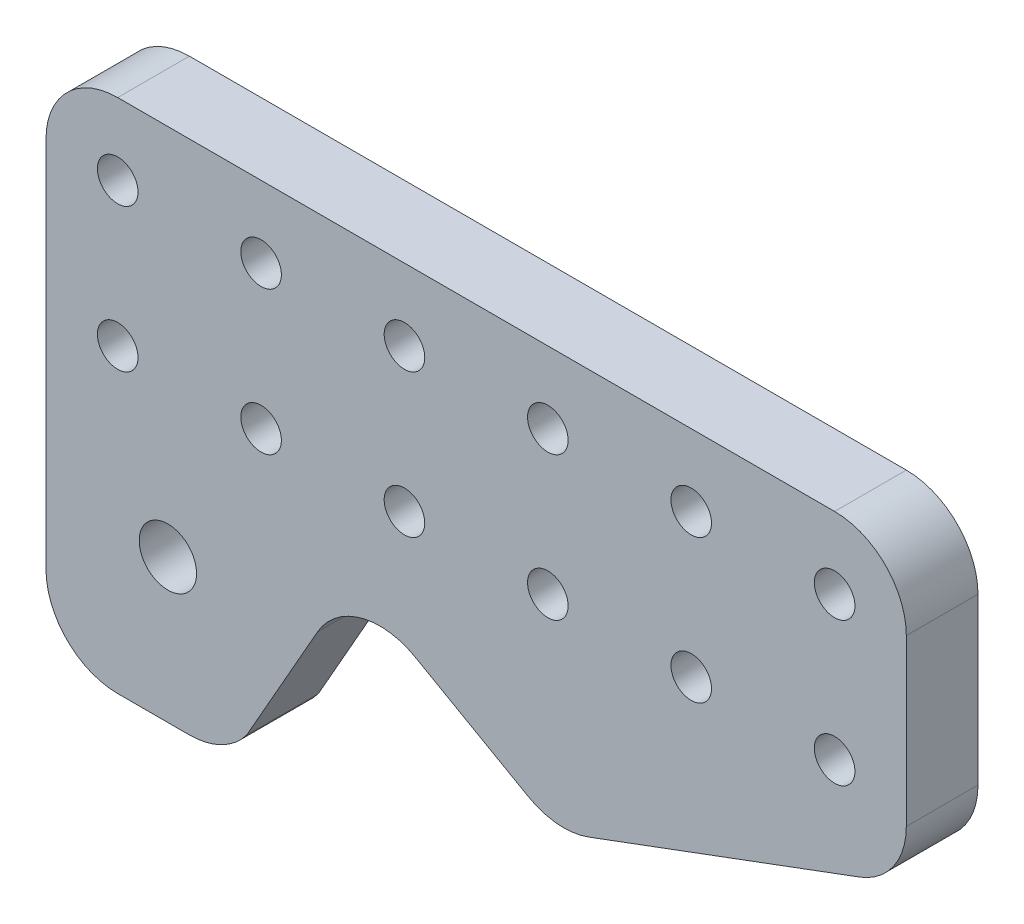
ISO-10303-21;
HEADER;
FILE_DESCRIPTION(('STEP AP214'),'2;1');
FILE_NAME('part.step','',(''),(''),'','','');
FILE_SCHEMA(('AUTOMOTIVE_DESIGN { 1 0 10303 214 1 1 1 1 }'));
ENDSEC;
DATA;
#1=APPLICATION_CONTEXT('core data for automotive mechanical design processes');
#2=APPLICATION_PROTOCOL_DEFINITION('international standard','automotive_design',2000,#1);
#3=PRODUCT_CONTEXT('',#1,'mechanical');
#4=PRODUCT('Part','Part','',(#3));
#5=PRODUCT_RELATED_PRODUCT_CATEGORY('part','',(#4));
#6=PRODUCT_DEFINITION_FORMATION('','',#4);
#7=PRODUCT_DEFINITION_CONTEXT('part definition',#1,'design');
#8=PRODUCT_DEFINITION('design','',#6,#7);
#9=PRODUCT_DEFINITION_SHAPE('','',#8);
#10=(LENGTH_UNIT() NAMED_UNIT(*) SI_UNIT(.MILLI.,.METRE.));
#11=(NAMED_UNIT(*) PLANE_ANGLE_UNIT() SI_UNIT($,.RADIAN.));
#12=(NAMED_UNIT(*) SI_UNIT($,.STERADIAN.) SOLID_ANGLE_UNIT());
#13=UNCERTAINTY_MEASURE_WITH_UNIT(LENGTH_MEASURE(1.E-05),#10,'distance_accuracy_value','');
#14=(GEOMETRIC_REPRESENTATION_CONTEXT(3) GLOBAL_UNCERTAINTY_ASSIGNED_CONTEXT((#13)) GLOBAL_UNIT_ASSIGNED_CONTEXT((#10,
#11,#12)) REPRESENTATION_CONTEXT('',''));
#15=CARTESIAN_POINT('',(0.,0.,0.));
#16=DIRECTION('',(0.,0.,1.));
#17=DIRECTION('',(1.,0.,0.));
#18=AXIS2_PLACEMENT_3D('',#15,#16,#17);
#19=CARTESIAN_POINT('',(0.,0.,6.35));
#20=DIRECTION('',(0.,0.,-1.));
#21=DIRECTION('',(-1.,0.,0.));
#22=AXIS2_PLACEMENT_3D('',#19,#20,#21);
#23=PLANE('',#22);
#24=DIRECTION('',(-0.869580115609544,0.493791881804968,0.));
#25=VECTOR('',#24,1.);
#26=CARTESIAN_POINT('',(27.1867353483846,19.1055012023618,6.35));
#27=LINE('',#26,#25);
#28=CARTESIAN_POINT('',(42.7225109022937,10.2834965263614,6.35));
#29=VERTEX_POINT('',#28);
#30=CARTESIAN_POINT('',(32.7085690825052,15.9699227529003,6.35));
#31=VERTEX_POINT('',#30);
#32=EDGE_CURVE('E247',#29,#31,#27,.T.);
#33=ORIENTED_EDGE('',*,*,#32,.F.);
#34=CARTESIAN_POINT('',(45.8580893517552,15.805330260482,6.35));
#35=DIRECTION('',(0.,0.,-1.));
#36=DIRECTION('',(-1.,0.,0.));
#37=AXIS2_PLACEMENT_3D('',#34,#35,#36);
#38=CIRCLE('',#37,6.35);
#39=CARTESIAN_POINT('',(48.0725484230912,9.85397150626651,6.35));
#40=VERTEX_POINT('',#39);
#41=EDGE_CURVE('E282',#29,#40,#38,.F.);
#42=ORIENTED_EDGE('',*,*,#41,.T.);
#43=DIRECTION('',(0.937221851057562,0.348733712021418,0.));
#44=VECTOR('',#43,1.);
#45=CARTESIAN_POINT('',(21.59,0.,6.35));
#46=LINE('',#45,#44);
#47=CARTESIAN_POINT('',(72.064459071336,18.7811940730553,6.35));
#48=VERTEX_POINT('',#47);
#49=EDGE_CURVE('E291',#40,#48,#46,.T.);
#50=ORIENTED_EDGE('',*,*,#49,.T.);
#51=CARTESIAN_POINT('',(69.85,24.7325528272708,6.35));
#52=DIRECTION('',(0.,0.,-1.));
#53=DIRECTION('',(-1.,0.,0.));
#54=AXIS2_PLACEMENT_3D('',#51,#52,#53);
#55=CIRCLE('',#54,6.35);
#56=CARTESIAN_POINT('',(76.2,24.7325528272708,6.35));
#57=VERTEX_POINT('',#56);
#58=EDGE_CURVE('E279',#48,#57,#55,.F.);
#59=ORIENTED_EDGE('',*,*,#58,.T.);
#60=DIRECTION('',(0.,1.,0.));
#61=VECTOR('',#60,1.);
#62=CARTESIAN_POINT('',(76.2,20.32,6.35));
#63=LINE('',#62,#61);
#64=CARTESIAN_POINT('',(76.2,39.37,6.35));
#65=VERTEX_POINT('',#64);
#66=EDGE_CURVE('E305',#57,#65,#63,.T.);
#67=ORIENTED_EDGE('',*,*,#66,.T.);
#68=CARTESIAN_POINT('',(69.85,39.37,6.35));
#69=DIRECTION('',(0.,0.,-1.));
#70=DIRECTION('',(-1.,0.,0.));
#71=AXIS2_PLACEMENT_3D('',#68,#69,#70);
#72=CIRCLE('',#71,6.35);
#73=CARTESIAN_POINT('',(69.85,45.72,6.35));
#74=VERTEX_POINT('',#73);
#75=EDGE_CURVE('E276',#65,#74,#72,.F.);
#76=ORIENTED_EDGE('',*,*,#75,.T.);
#77=DIRECTION('',(-1.,0.,0.));
#78=VECTOR('',#77,1.);
#79=CARTESIAN_POINT('',(0.,45.72,6.35));
#80=LINE('',#79,#78);
#81=CARTESIAN_POINT('',(6.35,45.72,6.35));
#82=VERTEX_POINT('',#81);
#83=EDGE_CURVE('E426',#74,#82,#80,.T.);
#84=ORIENTED_EDGE('',*,*,#83,.T.);
#85=CARTESIAN_POINT('',(6.35,39.37,6.35));
#86=DIRECTION('',(0.,0.,-1.));
#87=DIRECTION('',(-1.,0.,0.));
#88=AXIS2_PLACEMENT_3D('',#85,#86,#87);
#89=CIRCLE('',#88,6.35);
#90=CARTESIAN_POINT('',(0.,39.37,6.35));
#91=VERTEX_POINT('',#90);
#92=EDGE_CURVE('E274',#82,#91,#89,.F.);
#93=ORIENTED_EDGE('',*,*,#92,.T.);
#94=DIRECTION('',(0.,-1.,0.));
#95=VECTOR('',#94,1.);
#96=CARTESIAN_POINT('',(0.,45.72,6.35));
#97=LINE('',#96,#95);
#98=CARTESIAN_POINT('',(0.,6.35,6.35));
#99=VERTEX_POINT('',#98);
#100=EDGE_CURVE('E430',#91,#99,#97,.T.);
#101=ORIENTED_EDGE('',*,*,#100,.T.);
#102=CARTESIAN_POINT('',(6.35,6.35,6.35));
#103=DIRECTION('',(0.,0.,-1.));
#104=DIRECTION('',(-1.,0.,0.));
#105=AXIS2_PLACEMENT_3D('',#102,#103,#104);
#106=CIRCLE('',#105,6.35);
#107=CARTESIAN_POINT('',(6.35,0.,6.35));
#108=VERTEX_POINT('',#107);
#109=EDGE_CURVE('E265',#99,#108,#106,.F.);
#110=ORIENTED_EDGE('',*,*,#109,.T.);
#111=DIRECTION('',(1.,0.,0.));
#112=VECTOR('',#111,1.);
#113=CARTESIAN_POINT('',(0.,0.,6.35));
#114=LINE('',#113,#112);
#115=CARTESIAN_POINT('',(12.7,0.,6.35));
#116=VERTEX_POINT('',#115);
#117=EDGE_CURVE('E298',#108,#116,#114,.T.);
#118=ORIENTED_EDGE('',*,*,#117,.T.);
#119=CARTESIAN_POINT('',(12.7,6.35,6.35));
#120=DIRECTION('',(0.,0.,-1.));
#121=DIRECTION('',(-1.,0.,0.));
#122=AXIS2_PLACEMENT_3D('',#119,#120,#121);
#123=CIRCLE('',#122,6.35);
#124=CARTESIAN_POINT('',(17.78,2.54,6.35));
#125=VERTEX_POINT('',#124);
#126=EDGE_CURVE('E261',#116,#125,#123,.F.);
#127=ORIENTED_EDGE('',*,*,#126,.T.);
#128=DIRECTION('',(-0.493791881804968,-0.869580115609545,0.));
#129=VECTOR('',#128,1.);
#130=CARTESIAN_POINT('',(17.78,2.54,6.35));
#131=LINE('',#130,#129);
#132=CARTESIAN_POINT('',(24.0511568989231,13.5836674682412,6.35));
#133=VERTEX_POINT('',#132);
#134=EDGE_CURVE('E190',#133,#125,#131,.T.);
#135=ORIENTED_EDGE('',*,*,#134,.F.);
#136=CARTESIAN_POINT('',(29.5729906330437,10.4480890187797,6.35));
#137=DIRECTION('',(0.,0.,-1.));
#138=DIRECTION('',(-1.,0.,0.));
#139=AXIS2_PLACEMENT_3D('',#136,#137,#138);
#140=CIRCLE('',#139,6.35);
#141=EDGE_CURVE('E52',#133,#31,#140,.T.);
#142=ORIENTED_EDGE('',*,*,#141,.T.);
#143=EDGE_LOOP('',(#33,#42,#50,#59,#67,#76,#84,#93,#101,#110,#118,#127,#135,#142));
#144=FACE_BOUND('',#143,.T.);
#145=CARTESIAN_POINT('',(10.795,12.7,6.35));
#146=DIRECTION('',(0.,0.,1.));
#147=DIRECTION('',(1.,0.,0.));
#148=AXIS2_PLACEMENT_3D('',#145,#146,#147);
#149=CIRCLE('',#148,2.54);
#150=CARTESIAN_POINT('',(13.335,12.7,6.35));
#151=VERTEX_POINT('',#150);
#152=EDGE_CURVE('E308',#151,#151,#149,.T.);
#153=ORIENTED_EDGE('',*,*,#152,.F.);
#154=EDGE_LOOP('',(#153));
#155=FACE_BOUND('',#154,.T.);
#156=CARTESIAN_POINT('',(69.85,39.37,6.35));
#157=DIRECTION('',(0.,0.,1.));
#158=DIRECTION('',(1.,0.,0.));
#159=AXIS2_PLACEMENT_3D('',#156,#157,#158);
#160=CIRCLE('',#159,1.79773058504601);
#161=CARTESIAN_POINT('',(71.647730585046,39.37,6.35));
#162=VERTEX_POINT('',#161);
#163=EDGE_CURVE('E414',#162,#162,#160,.T.);
#164=ORIENTED_EDGE('',*,*,#163,.F.);
#165=EDGE_LOOP('',(#164));
#166=FACE_BOUND('',#165,.T.);
#167=CARTESIAN_POINT('',(57.15,39.3699999999999,6.35));
#168=DIRECTION('',(0.,0.,1.));
#169=DIRECTION('',(1.,0.,0.));
#170=AXIS2_PLACEMENT_3D('',#167,#168,#169);
#171=CIRCLE('',#170,1.79773058504601);
#172=CARTESIAN_POINT('',(58.947730585046,39.3699999999999,6.35));
#173=VERTEX_POINT('',#172);
#174=EDGE_CURVE('E406',#173,#173,#171,.T.);
#175=ORIENTED_EDGE('',*,*,#174,.F.);
#176=EDGE_LOOP('',(#175));
#177=FACE_BOUND('',#176,.T.);
#178=CARTESIAN_POINT('',(44.45,39.3699999999998,6.35));
#179=DIRECTION('',(0.,0.,1.));
#180=DIRECTION('',(1.,0.,0.));
#181=AXIS2_PLACEMENT_3D('',#178,#179,#180);
#182=CIRCLE('',#181,1.79773058504601);
#183=CARTESIAN_POINT('',(46.247730585046,39.3699999999998,6.35));
#184=VERTEX_POINT('',#183);
#185=EDGE_CURVE('E398',#184,#184,#182,.T.);
#186=ORIENTED_EDGE('',*,*,#185,.F.);
#187=EDGE_LOOP('',(#186));
#188=FACE_BOUND('',#187,.T.);
#189=CARTESIAN_POINT('',(31.75,39.3699999999997,6.35));
#190=DIRECTION('',(0.,0.,1.));
#191=DIRECTION('',(1.,0.,0.));
#192=AXIS2_PLACEMENT_3D('',#189,#190,#191);
#193=CIRCLE('',#192,1.79773058504601);
#194=CARTESIAN_POINT('',(33.5477305850461,39.3699999999997,6.35));
#195=VERTEX_POINT('',#194);
#196=EDGE_CURVE('E390',#195,#195,#193,.T.);
#197=ORIENTED_EDGE('',*,*,#196,.F.);
#198=EDGE_LOOP('',(#197));
#199=FACE_BOUND('',#198,.T.);
#200=CARTESIAN_POINT('',(19.0500000000001,39.3699999999996,6.35));
#201=DIRECTION('',(0.,0.,1.));
#202=DIRECTION('',(1.,0.,0.));
#203=AXIS2_PLACEMENT_3D('',#200,#201,#202);
#204=CIRCLE('',#203,1.797730585046);
#205=CARTESIAN_POINT('',(20.8477305850461,39.3699999999996,6.35));
#206=VERTEX_POINT('',#205);
#207=EDGE_CURVE('E384',#206,#206,#204,.T.);
#208=ORIENTED_EDGE('',*,*,#207,.F.);
#209=EDGE_LOOP('',(#208));
#210=FACE_BOUND('',#209,.T.);
#211=CARTESIAN_POINT('',(6.35000000000006,39.3699999999996,6.35));
#212=DIRECTION('',(0.,0.,1.));
#213=DIRECTION('',(1.,0.,0.));
#214=AXIS2_PLACEMENT_3D('',#211,#212,#213);
#215=CIRCLE('',#214,1.79773058504601);
#216=CARTESIAN_POINT('',(8.14773058504607,39.3699999999996,6.35));
#217=VERTEX_POINT('',#216);
#218=EDGE_CURVE('E378',#217,#217,#215,.T.);
#219=ORIENTED_EDGE('',*,*,#218,.F.);
#220=EDGE_LOOP('',(#219));
#221=FACE_BOUND('',#220,.T.);
#222=CARTESIAN_POINT('',(57.1500000000002,26.6699999999999,6.35));
#223=DIRECTION('',(0.,0.,1.));
#224=DIRECTION('',(1.,0.,0.));
#225=AXIS2_PLACEMENT_3D('',#222,#223,#224);
#226=CIRCLE('',#225,1.79773058504601);
#227=CARTESIAN_POINT('',(58.9477305850462,26.6699999999999,6.35));
#228=VERTEX_POINT('',#227);
#229=EDGE_CURVE('E370',#228,#228,#226,.T.);
#230=ORIENTED_EDGE('',*,*,#229,.F.);
#231=EDGE_LOOP('',(#230));
#232=FACE_BOUND('',#231,.T.);
#233=CARTESIAN_POINT('',(44.4500000000002,26.6699999999998,6.35));
#234=DIRECTION('',(0.,0.,1.));
#235=DIRECTION('',(1.,0.,0.));
#236=AXIS2_PLACEMENT_3D('',#233,#234,#235);
#237=CIRCLE('',#236,1.79773058504601);
#238=CARTESIAN_POINT('',(46.2477305850462,26.6699999999998,6.35));
#239=VERTEX_POINT('',#238);
#240=EDGE_CURVE('E362',#239,#239,#237,.T.);
#241=ORIENTED_EDGE('',*,*,#240,.F.);
#242=EDGE_LOOP('',(#241));
#243=FACE_BOUND('',#242,.T.);
#244=CARTESIAN_POINT('',(31.7500000000002,26.6699999999998,6.35));
#245=DIRECTION('',(0.,0.,1.));
#246=DIRECTION('',(1.,0.,0.));
#247=AXIS2_PLACEMENT_3D('',#244,#245,#246);
#248=CIRCLE('',#247,1.79773058504601);
#249=CARTESIAN_POINT('',(33.5477305850462,26.6699999999998,6.35));
#250=VERTEX_POINT('',#249);
#251=EDGE_CURVE('E354',#250,#250,#248,.T.);
#252=ORIENTED_EDGE('',*,*,#251,.F.);
#253=EDGE_LOOP('',(#252));
#254=FACE_BOUND('',#253,.T.);
#255=CARTESIAN_POINT('',(19.0500000000002,26.6699999999997,6.35));
#256=DIRECTION('',(0.,0.,1.));
#257=DIRECTION('',(1.,0.,0.));
#258=AXIS2_PLACEMENT_3D('',#255,#256,#257);
#259=CIRCLE('',#258,1.79773058504601);
#260=CARTESIAN_POINT('',(20.8477305850462,26.6699999999997,6.35));
#261=VERTEX_POINT('',#260);
#262=EDGE_CURVE('E346',#261,#261,#259,.T.);
#263=ORIENTED_EDGE('',*,*,#262,.F.);
#264=EDGE_LOOP('',(#263));
#265=FACE_BOUND('',#264,.T.);
#266=CARTESIAN_POINT('',(6.3500000000002,26.6699999999996,6.35));
#267=DIRECTION('',(0.,0.,1.));
#268=DIRECTION('',(1.,0.,0.));
#269=AXIS2_PLACEMENT_3D('',#266,#267,#268);
#270=CIRCLE('',#269,1.79773058504601);
#271=CARTESIAN_POINT('',(8.14773058504621,26.6699999999996,6.35));
#272=VERTEX_POINT('',#271);
#273=EDGE_CURVE('E338',#272,#272,#270,.T.);
#274=ORIENTED_EDGE('',*,*,#273,.F.);
#275=EDGE_LOOP('',(#274));
#276=FACE_BOUND('',#275,.T.);
#277=CARTESIAN_POINT('',(69.8500000000002,26.67,6.35));
#278=DIRECTION('',(0.,0.,1.));
#279=DIRECTION('',(1.,0.,0.));
#280=AXIS2_PLACEMENT_3D('',#277,#278,#279);
#281=CIRCLE('',#280,1.79773058504601);
#282=CARTESIAN_POINT('',(71.6477305850462,26.67,6.35));
#283=VERTEX_POINT('',#282);
#284=EDGE_CURVE('E331',#283,#283,#281,.T.);
#285=ORIENTED_EDGE('',*,*,#284,.F.);
#286=EDGE_LOOP('',(#285));
#287=FACE_BOUND('',#286,.T.);
#288=ADVANCED_FACE('F43',(#144,#155,#166,#177,#188,#199,#210,#221,#232,#243,#254,#265,#276,
#287),#23,.F.);
#289=CARTESIAN_POINT('',(0.,0.,0.));
#290=DIRECTION('',(0.,0.,-1.));
#291=DIRECTION('',(-1.,0.,0.));
#292=AXIS2_PLACEMENT_3D('',#289,#290,#291);
#293=PLANE('',#292);
#294=DIRECTION('',(0.937221851057562,0.348733712021418,0.));
#295=VECTOR('',#294,1.);
#296=CARTESIAN_POINT('',(21.59,0.,0.));
#297=LINE('',#296,#295);
#298=CARTESIAN_POINT('',(48.0725484230912,9.85397150626651,0.));
#299=VERTEX_POINT('',#298);
#300=CARTESIAN_POINT('',(72.064459071336,18.7811940730553,0.));
#301=VERTEX_POINT('',#300);
#302=EDGE_CURVE('E293',#299,#301,#297,.T.);
#303=ORIENTED_EDGE('',*,*,#302,.F.);
#304=CARTESIAN_POINT('',(45.8580893517552,15.805330260482,0.));
#305=DIRECTION('',(0.,0.,-1.));
#306=DIRECTION('',(-1.,0.,0.));
#307=AXIS2_PLACEMENT_3D('',#304,#305,#306);
#308=CIRCLE('',#307,6.35);
#309=CARTESIAN_POINT('',(42.7225109022937,10.2834965263614,0.));
#310=VERTEX_POINT('',#309);
#311=EDGE_CURVE('E216',#299,#310,#308,.T.);
#312=ORIENTED_EDGE('',*,*,#311,.T.);
#313=DIRECTION('',(-0.869580115609544,0.493791881804968,0.));
#314=VECTOR('',#313,1.);
#315=CARTESIAN_POINT('',(27.1867353483846,19.1055012023618,0.));
#316=LINE('',#315,#314);
#317=CARTESIAN_POINT('',(32.7085690825052,15.9699227529003,0.));
#318=VERTEX_POINT('',#317);
#319=EDGE_CURVE('E184',#310,#318,#316,.T.);
#320=ORIENTED_EDGE('',*,*,#319,.T.);
#321=CARTESIAN_POINT('',(29.5729906330437,10.4480890187797,0.));
#322=DIRECTION('',(0.,0.,-1.));
#323=DIRECTION('',(-1.,0.,0.));
#324=AXIS2_PLACEMENT_3D('',#321,#322,#323);
#325=CIRCLE('',#324,6.35);
#326=CARTESIAN_POINT('',(24.0511568989231,13.5836674682412,0.));
#327=VERTEX_POINT('',#326);
#328=EDGE_CURVE('E11',#318,#327,#325,.F.);
#329=ORIENTED_EDGE('',*,*,#328,.T.);
#330=DIRECTION('',(-0.493791881804968,-0.869580115609545,0.));
#331=VECTOR('',#330,1.);
#332=CARTESIAN_POINT('',(17.78,2.54,0.));
#333=LINE('',#332,#331);
#334=CARTESIAN_POINT('',(17.78,2.54,0.));
#335=VERTEX_POINT('',#334);
#336=EDGE_CURVE('E168',#327,#335,#333,.T.);
#337=ORIENTED_EDGE('',*,*,#336,.T.);
#338=CARTESIAN_POINT('',(12.7,6.35,0.));
#339=DIRECTION('',(0.,0.,-1.));
#340=DIRECTION('',(-1.,0.,0.));
#341=AXIS2_PLACEMENT_3D('',#338,#339,#340);
#342=CIRCLE('',#341,6.35);
#343=CARTESIAN_POINT('',(12.7,0.,0.));
#344=VERTEX_POINT('',#343);
#345=EDGE_CURVE('E175',#335,#344,#342,.T.);
#346=ORIENTED_EDGE('',*,*,#345,.T.);
#347=DIRECTION('',(1.,0.,0.));
#348=VECTOR('',#347,1.);
#349=CARTESIAN_POINT('',(0.,0.,0.));
#350=LINE('',#349,#348);
#351=CARTESIAN_POINT('',(6.35,0.,0.));
#352=VERTEX_POINT('',#351);
#353=EDGE_CURVE('E323',#352,#344,#350,.T.);
#354=ORIENTED_EDGE('',*,*,#353,.F.);
#355=CARTESIAN_POINT('',(6.35,6.35,0.));
#356=DIRECTION('',(0.,0.,-1.));
#357=DIRECTION('',(-1.,0.,0.));
#358=AXIS2_PLACEMENT_3D('',#355,#356,#357);
#359=CIRCLE('',#358,6.35);
#360=CARTESIAN_POINT('',(0.,6.35,0.));
#361=VERTEX_POINT('',#360);
#362=EDGE_CURVE('E199',#352,#361,#359,.T.);
#363=ORIENTED_EDGE('',*,*,#362,.T.);
#364=DIRECTION('',(0.,-1.,0.));
#365=VECTOR('',#364,1.);
#366=CARTESIAN_POINT('',(0.,45.72,0.));
#367=LINE('',#366,#365);
#368=CARTESIAN_POINT('',(0.,39.37,0.));
#369=VERTEX_POINT('',#368);
#370=EDGE_CURVE('E312',#369,#361,#367,.T.);
#371=ORIENTED_EDGE('',*,*,#370,.F.);
#372=CARTESIAN_POINT('',(6.35,39.37,0.));
#373=DIRECTION('',(0.,0.,-1.));
#374=DIRECTION('',(-1.,0.,0.));
#375=AXIS2_PLACEMENT_3D('',#372,#373,#374);
#376=CIRCLE('',#375,6.35);
#377=CARTESIAN_POINT('',(6.35,45.72,0.));
#378=VERTEX_POINT('',#377);
#379=EDGE_CURVE('E204',#369,#378,#376,.T.);
#380=ORIENTED_EDGE('',*,*,#379,.T.);
#381=DIRECTION('',(-1.,0.,0.));
#382=VECTOR('',#381,1.);
#383=CARTESIAN_POINT('',(0.,45.72,0.));
#384=LINE('',#383,#382);
#385=CARTESIAN_POINT('',(69.85,45.72,0.));
#386=VERTEX_POINT('',#385);
#387=EDGE_CURVE('E307',#386,#378,#384,.T.);
#388=ORIENTED_EDGE('',*,*,#387,.F.);
#389=CARTESIAN_POINT('',(69.85,39.37,0.));
#390=DIRECTION('',(0.,0.,-1.));
#391=DIRECTION('',(-1.,0.,0.));
#392=AXIS2_PLACEMENT_3D('',#389,#390,#391);
#393=CIRCLE('',#392,6.35);
#394=CARTESIAN_POINT('',(76.2,39.37,0.));
#395=VERTEX_POINT('',#394);
#396=EDGE_CURVE('E61',#386,#395,#393,.T.);
#397=ORIENTED_EDGE('',*,*,#396,.T.);
#398=DIRECTION('',(0.,1.,0.));
#399=VECTOR('',#398,1.);
#400=CARTESIAN_POINT('',(76.2,20.32,0.));
#401=LINE('',#400,#399);
#402=CARTESIAN_POINT('',(76.2,24.7325528272708,0.));
#403=VERTEX_POINT('',#402);
#404=EDGE_CURVE('E303',#403,#395,#401,.T.);
#405=ORIENTED_EDGE('',*,*,#404,.F.);
#406=CARTESIAN_POINT('',(69.85,24.7325528272708,0.));
#407=DIRECTION('',(0.,0.,-1.));
#408=DIRECTION('',(-1.,0.,0.));
#409=AXIS2_PLACEMENT_3D('',#406,#407,#408);
#410=CIRCLE('',#409,6.35);
#411=EDGE_CURVE('E72',#403,#301,#410,.T.);
#412=ORIENTED_EDGE('',*,*,#411,.T.);
#413=EDGE_LOOP('',(#303,#312,#320,#329,#337,#346,#354,#363,#371,#380,#388,#397,#405,#412));
#414=FACE_BOUND('',#413,.T.);
#415=CARTESIAN_POINT('',(6.3500000000002,26.6699999999996,0.));
#416=DIRECTION('',(0.,0.,1.));
#417=DIRECTION('',(1.,0.,0.));
#418=AXIS2_PLACEMENT_3D('',#415,#416,#417);
#419=CIRCLE('',#418,1.79773058504601);
#420=CARTESIAN_POINT('',(8.14773058504621,26.6699999999996,0.));
#421=VERTEX_POINT('',#420);
#422=EDGE_CURVE('E335',#421,#421,#419,.T.);
#423=ORIENTED_EDGE('',*,*,#422,.T.);
#424=EDGE_LOOP('',(#423));
#425=FACE_BOUND('',#424,.T.);
#426=CARTESIAN_POINT('',(31.7500000000002,26.6699999999998,0.));
#427=DIRECTION('',(0.,0.,1.));
#428=DIRECTION('',(1.,0.,0.));
#429=AXIS2_PLACEMENT_3D('',#426,#427,#428);
#430=CIRCLE('',#429,1.79773058504601);
#431=CARTESIAN_POINT('',(33.5477305850462,26.6699999999998,0.));
#432=VERTEX_POINT('',#431);
#433=EDGE_CURVE('E350',#432,#432,#430,.T.);
#434=ORIENTED_EDGE('',*,*,#433,.T.);
#435=EDGE_LOOP('',(#434));
#436=FACE_BOUND('',#435,.T.);
#437=CARTESIAN_POINT('',(57.1500000000002,26.6699999999999,0.));
#438=DIRECTION('',(0.,0.,1.));
#439=DIRECTION('',(1.,0.,0.));
#440=AXIS2_PLACEMENT_3D('',#437,#438,#439);
#441=CIRCLE('',#440,1.79773058504601);
#442=CARTESIAN_POINT('',(58.9477305850462,26.6699999999999,0.));
#443=VERTEX_POINT('',#442);
#444=EDGE_CURVE('E366',#443,#443,#441,.T.);
#445=ORIENTED_EDGE('',*,*,#444,.T.);
#446=EDGE_LOOP('',(#445));
#447=FACE_BOUND('',#446,.T.);
#448=CARTESIAN_POINT('',(19.0500000000001,39.3699999999996,0.));
#449=DIRECTION('',(0.,0.,1.));
#450=DIRECTION('',(1.,0.,0.));
#451=AXIS2_PLACEMENT_3D('',#448,#449,#450);
#452=CIRCLE('',#451,1.797730585046);
#453=CARTESIAN_POINT('',(20.8477305850461,39.3699999999996,0.));
#454=VERTEX_POINT('',#453);
#455=EDGE_CURVE('E381',#454,#454,#452,.T.);
#456=ORIENTED_EDGE('',*,*,#455,.T.);
#457=EDGE_LOOP('',(#456));
#458=FACE_BOUND('',#457,.T.);
#459=CARTESIAN_POINT('',(44.45,39.3699999999998,0.));
#460=DIRECTION('',(0.,0.,1.));
#461=DIRECTION('',(1.,0.,0.));
#462=AXIS2_PLACEMENT_3D('',#459,#460,#461);
#463=CIRCLE('',#462,1.79773058504601);
#464=CARTESIAN_POINT('',(46.247730585046,39.3699999999998,0.));
#465=VERTEX_POINT('',#464);
#466=EDGE_CURVE('E394',#465,#465,#463,.T.);
#467=ORIENTED_EDGE('',*,*,#466,.T.);
#468=EDGE_LOOP('',(#467));
#469=FACE_BOUND('',#468,.T.);
#470=CARTESIAN_POINT('',(69.85,39.37,0.));
#471=DIRECTION('',(0.,0.,1.));
#472=DIRECTION('',(1.,0.,0.));
#473=AXIS2_PLACEMENT_3D('',#470,#471,#472);
#474=CIRCLE('',#473,1.79773058504601);
#475=CARTESIAN_POINT('',(71.647730585046,39.37,0.));
#476=VERTEX_POINT('',#475);
#477=EDGE_CURVE('E410',#476,#476,#474,.T.);
#478=ORIENTED_EDGE('',*,*,#477,.T.);
#479=EDGE_LOOP('',(#478));
#480=FACE_BOUND('',#479,.T.);
#481=CARTESIAN_POINT('',(10.795,12.7,0.));
#482=DIRECTION('',(0.,0.,1.));
#483=DIRECTION('',(1.,0.,0.));
#484=AXIS2_PLACEMENT_3D('',#481,#482,#483);
#485=CIRCLE('',#484,2.54);
#486=CARTESIAN_POINT('',(13.335,12.7,0.));
#487=VERTEX_POINT('',#486);
#488=EDGE_CURVE('E316',#487,#487,#485,.T.);
#489=ORIENTED_EDGE('',*,*,#488,.T.);
#490=EDGE_LOOP('',(#489));
#491=FACE_BOUND('',#490,.T.);
#492=CARTESIAN_POINT('',(57.15,39.3699999999999,0.));
#493=DIRECTION('',(0.,0.,1.));
#494=DIRECTION('',(1.,0.,0.));
#495=AXIS2_PLACEMENT_3D('',#492,#493,#494);
#496=CIRCLE('',#495,1.79773058504601);
#497=CARTESIAN_POINT('',(58.947730585046,39.3699999999999,0.));
#498=VERTEX_POINT('',#497);
#499=EDGE_CURVE('E402',#498,#498,#496,.T.);
#500=ORIENTED_EDGE('',*,*,#499,.T.);
#501=EDGE_LOOP('',(#500));
#502=FACE_BOUND('',#501,.T.);
#503=CARTESIAN_POINT('',(31.75,39.3699999999997,0.));
#504=DIRECTION('',(0.,0.,1.));
#505=DIRECTION('',(1.,0.,0.));
#506=AXIS2_PLACEMENT_3D('',#503,#504,#505);
#507=CIRCLE('',#506,1.79773058504601);
#508=CARTESIAN_POINT('',(33.5477305850461,39.3699999999997,0.));
#509=VERTEX_POINT('',#508);
#510=EDGE_CURVE('E387',#509,#509,#507,.T.);
#511=ORIENTED_EDGE('',*,*,#510,.T.);
#512=EDGE_LOOP('',(#511));
#513=FACE_BOUND('',#512,.T.);
#514=CARTESIAN_POINT('',(6.35000000000006,39.3699999999996,0.));
#515=DIRECTION('',(0.,0.,1.));
#516=DIRECTION('',(1.,0.,0.));
#517=AXIS2_PLACEMENT_3D('',#514,#515,#516);
#518=CIRCLE('',#517,1.79773058504601);
#519=CARTESIAN_POINT('',(8.14773058504607,39.3699999999996,0.));
#520=VERTEX_POINT('',#519);
#521=EDGE_CURVE('E374',#520,#520,#518,.T.);
#522=ORIENTED_EDGE('',*,*,#521,.T.);
#523=EDGE_LOOP('',(#522));
#524=FACE_BOUND('',#523,.T.);
#525=CARTESIAN_POINT('',(44.4500000000002,26.6699999999998,0.));
#526=DIRECTION('',(0.,0.,1.));
#527=DIRECTION('',(1.,0.,0.));
#528=AXIS2_PLACEMENT_3D('',#525,#526,#527);
#529=CIRCLE('',#528,1.79773058504601);
#530=CARTESIAN_POINT('',(46.2477305850462,26.6699999999998,0.));
#531=VERTEX_POINT('',#530);
#532=EDGE_CURVE('E358',#531,#531,#529,.T.);
#533=ORIENTED_EDGE('',*,*,#532,.T.);
#534=EDGE_LOOP('',(#533));
#535=FACE_BOUND('',#534,.T.);
#536=CARTESIAN_POINT('',(19.0500000000002,26.6699999999997,0.));
#537=DIRECTION('',(0.,0.,1.));
#538=DIRECTION('',(1.,0.,0.));
#539=AXIS2_PLACEMENT_3D('',#536,#537,#538);
#540=CIRCLE('',#539,1.79773058504601);
#541=CARTESIAN_POINT('',(20.8477305850462,26.6699999999997,0.));
#542=VERTEX_POINT('',#541);
#543=EDGE_CURVE('E342',#542,#542,#540,.T.);
#544=ORIENTED_EDGE('',*,*,#543,.T.);
#545=EDGE_LOOP('',(#544));
#546=FACE_BOUND('',#545,.T.);
#547=CARTESIAN_POINT('',(69.8500000000002,26.67,0.));
#548=DIRECTION('',(0.,0.,1.));
#549=DIRECTION('',(1.,0.,0.));
#550=AXIS2_PLACEMENT_3D('',#547,#548,#549);
#551=CIRCLE('',#550,1.79773058504601);
#552=CARTESIAN_POINT('',(71.6477305850462,26.67,0.));
#553=VERTEX_POINT('',#552);
#554=EDGE_CURVE('E193',#553,#553,#551,.T.);
#555=ORIENTED_EDGE('',*,*,#554,.T.);
#556=EDGE_LOOP('',(#555));
#557=FACE_BOUND('',#556,.T.);
#558=ADVANCED_FACE('F171',(#414,#425,#436,#447,#458,#469,#480,#491,#502,#513,#524,#535,#546,
#557),#293,.T.);
#559=CARTESIAN_POINT('',(76.2,20.32,6.35));
#560=DIRECTION('',(-1.,0.,0.));
#561=DIRECTION('',(0.,0.,1.));
#562=AXIS2_PLACEMENT_3D('',#559,#560,#561);
#563=PLANE('',#562);
#564=ORIENTED_EDGE('',*,*,#66,.F.);
#565=DIRECTION('',(0.,0.,-1.));
#566=VECTOR('',#565,1.);
#567=CARTESIAN_POINT('',(76.2,24.7325528272708,6.35));
#568=LINE('',#567,#566);
#569=EDGE_CURVE('E222',#57,#403,#568,.T.);
#570=ORIENTED_EDGE('',*,*,#569,.T.);
#571=ORIENTED_EDGE('',*,*,#404,.T.);
#572=DIRECTION('',(0.,0.,-1.));
#573=VECTOR('',#572,1.);
#574=CARTESIAN_POINT('',(76.2,39.37,6.35));
#575=LINE('',#574,#573);
#576=EDGE_CURVE('E219',#395,#65,#575,.F.);
#577=ORIENTED_EDGE('',*,*,#576,.T.);
#578=EDGE_LOOP('',(#564,#570,#571,#577));
#579=FACE_BOUND('',#578,.T.);
#580=ADVANCED_FACE('F302',(#579),#563,.F.);
#581=CARTESIAN_POINT('',(0.,45.72,6.35));
#582=DIRECTION('',(0.,-1.,0.));
#583=DIRECTION('',(0.,0.,-1.));
#584=AXIS2_PLACEMENT_3D('',#581,#582,#583);
#585=PLANE('',#584);
#586=ORIENTED_EDGE('',*,*,#83,.F.);
#587=DIRECTION('',(0.,0.,-1.));
#588=VECTOR('',#587,1.);
#589=CARTESIAN_POINT('',(69.85,45.72,6.35));
#590=LINE('',#589,#588);
#591=EDGE_CURVE('E227',#74,#386,#590,.T.);
#592=ORIENTED_EDGE('',*,*,#591,.T.);
#593=ORIENTED_EDGE('',*,*,#387,.T.);
#594=DIRECTION('',(0.,0.,-1.));
#595=VECTOR('',#594,1.);
#596=CARTESIAN_POINT('',(6.35,45.72,6.35));
#597=LINE('',#596,#595);
#598=EDGE_CURVE('E225',#378,#82,#597,.F.);
#599=ORIENTED_EDGE('',*,*,#598,.T.);
#600=EDGE_LOOP('',(#586,#592,#593,#599));
#601=FACE_BOUND('',#600,.T.);
#602=ADVANCED_FACE('F454',(#601),#585,.F.);
#603=CARTESIAN_POINT('',(0.,45.72,6.35));
#604=DIRECTION('',(1.,0.,0.));
#605=DIRECTION('',(0.,1.,0.));
#606=AXIS2_PLACEMENT_3D('',#603,#604,#605);
#607=PLANE('',#606);
#608=ORIENTED_EDGE('',*,*,#100,.F.);
#609=DIRECTION('',(0.,0.,-1.));
#610=VECTOR('',#609,1.);
#611=CARTESIAN_POINT('',(0.,39.37,6.35));
#612=LINE('',#611,#610);
#613=EDGE_CURVE('E234',#91,#369,#612,.T.);
#614=ORIENTED_EDGE('',*,*,#613,.T.);
#615=ORIENTED_EDGE('',*,*,#370,.T.);
#616=DIRECTION('',(0.,0.,-1.));
#617=VECTOR('',#616,1.);
#618=CARTESIAN_POINT('',(0.,6.35,6.35));
#619=LINE('',#618,#617);
#620=EDGE_CURVE('E231',#361,#99,#619,.F.);
#621=ORIENTED_EDGE('',*,*,#620,.T.);
#622=EDGE_LOOP('',(#608,#614,#615,#621));
#623=FACE_BOUND('',#622,.T.);
#624=ADVANCED_FACE('F446',(#623),#607,.F.);
#625=CARTESIAN_POINT('',(0.,0.,6.35));
#626=DIRECTION('',(0.,1.,0.));
#627=DIRECTION('',(0.,0.,1.));
#628=AXIS2_PLACEMENT_3D('',#625,#626,#627);
#629=PLANE('',#628);
#630=ORIENTED_EDGE('',*,*,#117,.F.);
#631=DIRECTION('',(0.,0.,-1.));
#632=VECTOR('',#631,1.);
#633=CARTESIAN_POINT('',(6.35,0.,6.35));
#634=LINE('',#633,#632);
#635=EDGE_CURVE('E239',#108,#352,#634,.T.);
#636=ORIENTED_EDGE('',*,*,#635,.T.);
#637=ORIENTED_EDGE('',*,*,#353,.T.);
#638=DIRECTION('',(0.,0.,-1.));
#639=VECTOR('',#638,1.);
#640=CARTESIAN_POINT('',(12.7,0.,6.35));
#641=LINE('',#640,#639);
#642=EDGE_CURVE('E197',#344,#116,#641,.F.);
#643=ORIENTED_EDGE('',*,*,#642,.T.);
#644=EDGE_LOOP('',(#630,#636,#637,#643));
#645=FACE_BOUND('',#644,.T.);
#646=ADVANCED_FACE('F439',(#645),#629,.F.);
#647=CARTESIAN_POINT('',(21.59,0.,6.35));
#648=DIRECTION('',(-0.348733712021418,0.937221851057562,0.));
#649=DIRECTION('',(-0.937221851057562,-0.348733712021418,0.));
#650=AXIS2_PLACEMENT_3D('',#647,#648,#649);
#651=PLANE('',#650);
#652=ORIENTED_EDGE('',*,*,#49,.F.);
#653=DIRECTION('',(0.,0.,1.));
#654=VECTOR('',#653,1.);
#655=CARTESIAN_POINT('',(48.0725484230912,9.85397150626651,6.35));
#656=LINE('',#655,#654);
#657=EDGE_CURVE('E200',#40,#299,#656,.F.);
#658=ORIENTED_EDGE('',*,*,#657,.T.);
#659=ORIENTED_EDGE('',*,*,#302,.T.);
#660=DIRECTION('',(0.,0.,-1.));
#661=VECTOR('',#660,1.);
#662=CARTESIAN_POINT('',(72.064459071336,18.7811940730553,6.35));
#663=LINE('',#662,#661);
#664=EDGE_CURVE('E207',#301,#48,#663,.F.);
#665=ORIENTED_EDGE('',*,*,#664,.T.);
#666=EDGE_LOOP('',(#652,#658,#659,#665));
#667=FACE_BOUND('',#666,.T.);
#668=ADVANCED_FACE('F290',(#667),#651,.F.);
#669=CARTESIAN_POINT('',(10.795,12.7,6.35));
#670=DIRECTION('',(0.,0.,-1.));
#671=DIRECTION('',(-1.,0.,0.));
#672=AXIS2_PLACEMENT_3D('',#669,#670,#671);
#673=CYLINDRICAL_SURFACE('',#672,2.54);
#674=ORIENTED_EDGE('',*,*,#152,.T.);
#675=EDGE_LOOP('',(#674));
#676=FACE_BOUND('',#675,.T.);
#677=ORIENTED_EDGE('',*,*,#488,.F.);
#678=EDGE_LOOP('',(#677));
#679=FACE_BOUND('',#678,.T.);
#680=ADVANCED_FACE('F475',(#676,#679),#673,.F.);
#681=CARTESIAN_POINT('',(69.85,39.37,6.35));
#682=DIRECTION('',(0.,0.,-1.));
#683=DIRECTION('',(-1.,0.,0.));
#684=AXIS2_PLACEMENT_3D('',#681,#682,#683);
#685=CYLINDRICAL_SURFACE('',#684,1.79773058504601);
#686=ORIENTED_EDGE('',*,*,#163,.T.);
#687=EDGE_LOOP('',(#686));
#688=FACE_BOUND('',#687,.T.);
#689=ORIENTED_EDGE('',*,*,#477,.F.);
#690=EDGE_LOOP('',(#689));
#691=FACE_BOUND('',#690,.T.);
#692=ADVANCED_FACE('F670',(#688,#691),#685,.F.);
#693=CARTESIAN_POINT('',(57.15,39.3699999999999,6.35));
#694=DIRECTION('',(0.,0.,-1.));
#695=DIRECTION('',(-1.,0.,0.));
#696=AXIS2_PLACEMENT_3D('',#693,#694,#695);
#697=CYLINDRICAL_SURFACE('',#696,1.79773058504601);
#698=ORIENTED_EDGE('',*,*,#174,.T.);
#699=EDGE_LOOP('',(#698));
#700=FACE_BOUND('',#699,.T.);
#701=ORIENTED_EDGE('',*,*,#499,.F.);
#702=EDGE_LOOP('',(#701));
#703=FACE_BOUND('',#702,.T.);
#704=ADVANCED_FACE('F660',(#700,#703),#697,.F.);
#705=CARTESIAN_POINT('',(44.45,39.3699999999998,6.35));
#706=DIRECTION('',(0.,0.,-1.));
#707=DIRECTION('',(-1.,0.,0.));
#708=AXIS2_PLACEMENT_3D('',#705,#706,#707);
#709=CYLINDRICAL_SURFACE('',#708,1.79773058504601);
#710=ORIENTED_EDGE('',*,*,#185,.T.);
#711=EDGE_LOOP('',(#710));
#712=FACE_BOUND('',#711,.T.);
#713=ORIENTED_EDGE('',*,*,#466,.F.);
#714=EDGE_LOOP('',(#713));
#715=FACE_BOUND('',#714,.T.);
#716=ADVANCED_FACE('F650',(#712,#715),#709,.F.);
#717=CARTESIAN_POINT('',(31.75,39.3699999999997,6.35));
#718=DIRECTION('',(0.,0.,-1.));
#719=DIRECTION('',(-1.,0.,0.));
#720=AXIS2_PLACEMENT_3D('',#717,#718,#719);
#721=CYLINDRICAL_SURFACE('',#720,1.79773058504601);
#722=ORIENTED_EDGE('',*,*,#196,.T.);
#723=EDGE_LOOP('',(#722));
#724=FACE_BOUND('',#723,.T.);
#725=ORIENTED_EDGE('',*,*,#510,.F.);
#726=EDGE_LOOP('',(#725));
#727=FACE_BOUND('',#726,.T.);
#728=ADVANCED_FACE('F640',(#724,#727),#721,.F.);
#729=CARTESIAN_POINT('',(19.0500000000001,39.3699999999996,6.35));
#730=DIRECTION('',(0.,0.,-1.));
#731=DIRECTION('',(-1.,0.,0.));
#732=AXIS2_PLACEMENT_3D('',#729,#730,#731);
#733=CYLINDRICAL_SURFACE('',#732,1.797730585046);
#734=ORIENTED_EDGE('',*,*,#207,.T.);
#735=EDGE_LOOP('',(#734));
#736=FACE_BOUND('',#735,.T.);
#737=ORIENTED_EDGE('',*,*,#455,.F.);
#738=EDGE_LOOP('',(#737));
#739=FACE_BOUND('',#738,.T.);
#740=ADVANCED_FACE('F630',(#736,#739),#733,.F.);
#741=CARTESIAN_POINT('',(6.35000000000006,39.3699999999996,6.35));
#742=DIRECTION('',(0.,0.,-1.));
#743=DIRECTION('',(-1.,0.,0.));
#744=AXIS2_PLACEMENT_3D('',#741,#742,#743);
#745=CYLINDRICAL_SURFACE('',#744,1.79773058504601);
#746=ORIENTED_EDGE('',*,*,#218,.T.);
#747=EDGE_LOOP('',(#746));
#748=FACE_BOUND('',#747,.T.);
#749=ORIENTED_EDGE('',*,*,#521,.F.);
#750=EDGE_LOOP('',(#749));
#751=FACE_BOUND('',#750,.T.);
#752=ADVANCED_FACE('F620',(#748,#751),#745,.F.);
#753=CARTESIAN_POINT('',(57.1500000000002,26.6699999999999,6.35));
#754=DIRECTION('',(0.,0.,-1.));
#755=DIRECTION('',(-1.,0.,0.));
#756=AXIS2_PLACEMENT_3D('',#753,#754,#755);
#757=CYLINDRICAL_SURFACE('',#756,1.79773058504601);
#758=ORIENTED_EDGE('',*,*,#229,.T.);
#759=EDGE_LOOP('',(#758));
#760=FACE_BOUND('',#759,.T.);
#761=ORIENTED_EDGE('',*,*,#444,.F.);
#762=EDGE_LOOP('',(#761));
#763=FACE_BOUND('',#762,.T.);
#764=ADVANCED_FACE('F610',(#760,#763),#757,.F.);
#765=CARTESIAN_POINT('',(44.4500000000002,26.6699999999998,6.35));
#766=DIRECTION('',(0.,0.,-1.));
#767=DIRECTION('',(-1.,0.,0.));
#768=AXIS2_PLACEMENT_3D('',#765,#766,#767);
#769=CYLINDRICAL_SURFACE('',#768,1.79773058504601);
#770=ORIENTED_EDGE('',*,*,#240,.T.);
#771=EDGE_LOOP('',(#770));
#772=FACE_BOUND('',#771,.T.);
#773=ORIENTED_EDGE('',*,*,#532,.F.);
#774=EDGE_LOOP('',(#773));
#775=FACE_BOUND('',#774,.T.);
#776=ADVANCED_FACE('F600',(#772,#775),#769,.F.);
#777=CARTESIAN_POINT('',(31.7500000000002,26.6699999999998,6.35));
#778=DIRECTION('',(0.,0.,-1.));
#779=DIRECTION('',(-1.,0.,0.));
#780=AXIS2_PLACEMENT_3D('',#777,#778,#779);
#781=CYLINDRICAL_SURFACE('',#780,1.79773058504601);
#782=ORIENTED_EDGE('',*,*,#251,.T.);
#783=EDGE_LOOP('',(#782));
#784=FACE_BOUND('',#783,.T.);
#785=ORIENTED_EDGE('',*,*,#433,.F.);
#786=EDGE_LOOP('',(#785));
#787=FACE_BOUND('',#786,.T.);
#788=ADVANCED_FACE('F590',(#784,#787),#781,.F.);
#789=CARTESIAN_POINT('',(19.0500000000002,26.6699999999997,6.35));
#790=DIRECTION('',(0.,0.,-1.));
#791=DIRECTION('',(-1.,0.,0.));
#792=AXIS2_PLACEMENT_3D('',#789,#790,#791);
#793=CYLINDRICAL_SURFACE('',#792,1.79773058504601);
#794=ORIENTED_EDGE('',*,*,#262,.T.);
#795=EDGE_LOOP('',(#794));
#796=FACE_BOUND('',#795,.T.);
#797=ORIENTED_EDGE('',*,*,#543,.F.);
#798=EDGE_LOOP('',(#797));
#799=FACE_BOUND('',#798,.T.);
#800=ADVANCED_FACE('F580',(#796,#799),#793,.F.);
#801=CARTESIAN_POINT('',(6.3500000000002,26.6699999999996,6.35));
#802=DIRECTION('',(0.,0.,-1.));
#803=DIRECTION('',(-1.,0.,0.));
#804=AXIS2_PLACEMENT_3D('',#801,#802,#803);
#805=CYLINDRICAL_SURFACE('',#804,1.79773058504601);
#806=ORIENTED_EDGE('',*,*,#273,.T.);
#807=EDGE_LOOP('',(#806));
#808=FACE_BOUND('',#807,.T.);
#809=ORIENTED_EDGE('',*,*,#422,.F.);
#810=EDGE_LOOP('',(#809));
#811=FACE_BOUND('',#810,.T.);
#812=ADVANCED_FACE('F570',(#808,#811),#805,.F.);
#813=CARTESIAN_POINT('',(69.8500000000002,26.67,6.35));
#814=DIRECTION('',(0.,0.,-1.));
#815=DIRECTION('',(-1.,0.,0.));
#816=AXIS2_PLACEMENT_3D('',#813,#814,#815);
#817=CYLINDRICAL_SURFACE('',#816,1.79773058504601);
#818=ORIENTED_EDGE('',*,*,#284,.T.);
#819=EDGE_LOOP('',(#818));
#820=FACE_BOUND('',#819,.T.);
#821=ORIENTED_EDGE('',*,*,#554,.F.);
#822=EDGE_LOOP('',(#821));
#823=FACE_BOUND('',#822,.T.);
#824=ADVANCED_FACE('F561',(#820,#823),#817,.F.);
#825=CARTESIAN_POINT('',(17.78,2.54,0.));
#826=DIRECTION('',(-0.869580115609545,0.493791881804967,0.));
#827=DIRECTION('',(-0.493791881804968,-0.869580115609545,0.));
#828=AXIS2_PLACEMENT_3D('',#825,#826,#827);
#829=PLANE('',#828);
#830=ORIENTED_EDGE('',*,*,#336,.F.);
#831=DIRECTION('',(0.,0.,1.));
#832=VECTOR('',#831,1.);
#833=CARTESIAN_POINT('',(24.0511568989231,13.5836674682412,6.35));
#834=LINE('',#833,#832);
#835=EDGE_CURVE('E268',#327,#133,#834,.T.);
#836=ORIENTED_EDGE('',*,*,#835,.T.);
#837=ORIENTED_EDGE('',*,*,#134,.T.);
#838=DIRECTION('',(0.,0.,1.));
#839=VECTOR('',#838,1.);
#840=CARTESIAN_POINT('',(17.78,2.54,0.));
#841=LINE('',#840,#839);
#842=EDGE_CURVE('E183',#335,#125,#841,.T.);
#843=ORIENTED_EDGE('',*,*,#842,.F.);
#844=EDGE_LOOP('',(#830,#836,#837,#843));
#845=FACE_BOUND('',#844,.T.);
#846=ADVANCED_FACE('F188',(#845),#829,.F.);
#847=CARTESIAN_POINT('',(27.1867353483846,19.1055012023618,0.));
#848=DIRECTION('',(0.493791881804968,0.869580115609544,0.));
#849=DIRECTION('',(-0.869580115609544,0.493791881804968,0.));
#850=AXIS2_PLACEMENT_3D('',#847,#848,#849);
#851=PLANE('',#850);
#852=ORIENTED_EDGE('',*,*,#32,.T.);
#853=DIRECTION('',(0.,0.,1.));
#854=VECTOR('',#853,1.);
#855=CARTESIAN_POINT('',(32.7085690825052,15.9699227529003,0.));
#856=LINE('',#855,#854);
#857=EDGE_CURVE('E254',#31,#318,#856,.F.);
#858=ORIENTED_EDGE('',*,*,#857,.T.);
#859=ORIENTED_EDGE('',*,*,#319,.F.);
#860=DIRECTION('',(0.,0.,1.));
#861=VECTOR('',#860,1.);
#862=CARTESIAN_POINT('',(42.7225109022937,10.2834965263614,0.));
#863=LINE('',#862,#861);
#864=EDGE_CURVE('E256',#310,#29,#863,.T.);
#865=ORIENTED_EDGE('',*,*,#864,.T.);
#866=EDGE_LOOP('',(#852,#858,#859,#865));
#867=FACE_BOUND('',#866,.T.);
#868=ADVANCED_FACE('F252',(#867),#851,.F.);
#869=CARTESIAN_POINT('',(29.5729906330437,10.4480890187797,0.));
#870=DIRECTION('',(0.,0.,-1.));
#871=DIRECTION('',(-1.,0.,0.));
#872=AXIS2_PLACEMENT_3D('',#869,#870,#871);
#873=CYLINDRICAL_SURFACE('',#872,6.35);
#874=ORIENTED_EDGE('',*,*,#328,.F.);
#875=ORIENTED_EDGE('',*,*,#857,.F.);
#876=ORIENTED_EDGE('',*,*,#141,.F.);
#877=ORIENTED_EDGE('',*,*,#835,.F.);
#878=EDGE_LOOP('',(#874,#875,#876,#877));
#879=FACE_BOUND('',#878,.T.);
#880=ADVANCED_FACE('F259',(#879),#873,.F.);
#881=CARTESIAN_POINT('',(45.8580893517552,15.805330260482,0.));
#882=DIRECTION('',(0.,0.,1.));
#883=DIRECTION('',(1.,0.,0.));
#884=AXIS2_PLACEMENT_3D('',#881,#882,#883);
#885=CYLINDRICAL_SURFACE('',#884,6.35);
#886=ORIENTED_EDGE('',*,*,#311,.F.);
#887=ORIENTED_EDGE('',*,*,#657,.F.);
#888=ORIENTED_EDGE('',*,*,#41,.F.);
#889=ORIENTED_EDGE('',*,*,#864,.F.);
#890=EDGE_LOOP('',(#886,#887,#888,#889));
#891=FACE_BOUND('',#890,.T.);
#892=ADVANCED_FACE('F466',(#891),#885,.T.);
#893=CARTESIAN_POINT('',(69.85,24.7325528272708,6.35));
#894=DIRECTION('',(0.,0.,-1.));
#895=DIRECTION('',(-1.,0.,0.));
#896=AXIS2_PLACEMENT_3D('',#893,#894,#895);
#897=CYLINDRICAL_SURFACE('',#896,6.35);
#898=ORIENTED_EDGE('',*,*,#58,.F.);
#899=ORIENTED_EDGE('',*,*,#664,.F.);
#900=ORIENTED_EDGE('',*,*,#411,.F.);
#901=ORIENTED_EDGE('',*,*,#569,.F.);
#902=EDGE_LOOP('',(#898,#899,#900,#901));
#903=FACE_BOUND('',#902,.T.);
#904=ADVANCED_FACE('F300',(#903),#897,.T.);
#905=CARTESIAN_POINT('',(69.85,39.37,6.35));
#906=DIRECTION('',(0.,0.,-1.));
#907=DIRECTION('',(-1.,0.,0.));
#908=AXIS2_PLACEMENT_3D('',#905,#906,#907);
#909=CYLINDRICAL_SURFACE('',#908,6.35);
#910=ORIENTED_EDGE('',*,*,#75,.F.);
#911=ORIENTED_EDGE('',*,*,#576,.F.);
#912=ORIENTED_EDGE('',*,*,#396,.F.);
#913=ORIENTED_EDGE('',*,*,#591,.F.);
#914=EDGE_LOOP('',(#910,#911,#912,#913));
#915=FACE_BOUND('',#914,.T.);
#916=ADVANCED_FACE('F458',(#915),#909,.T.);
#917=CARTESIAN_POINT('',(6.35,39.37,6.35));
#918=DIRECTION('',(0.,0.,-1.));
#919=DIRECTION('',(-1.,0.,0.));
#920=AXIS2_PLACEMENT_3D('',#917,#918,#919);
#921=CYLINDRICAL_SURFACE('',#920,6.35);
#922=ORIENTED_EDGE('',*,*,#92,.F.);
#923=ORIENTED_EDGE('',*,*,#598,.F.);
#924=ORIENTED_EDGE('',*,*,#379,.F.);
#925=ORIENTED_EDGE('',*,*,#613,.F.);
#926=EDGE_LOOP('',(#922,#923,#924,#925));
#927=FACE_BOUND('',#926,.T.);
#928=ADVANCED_FACE('F450',(#927),#921,.T.);
#929=CARTESIAN_POINT('',(6.35,6.35,6.35));
#930=DIRECTION('',(0.,0.,-1.));
#931=DIRECTION('',(-1.,0.,0.));
#932=AXIS2_PLACEMENT_3D('',#929,#930,#931);
#933=CYLINDRICAL_SURFACE('',#932,6.35);
#934=ORIENTED_EDGE('',*,*,#109,.F.);
#935=ORIENTED_EDGE('',*,*,#620,.F.);
#936=ORIENTED_EDGE('',*,*,#362,.F.);
#937=ORIENTED_EDGE('',*,*,#635,.F.);
#938=EDGE_LOOP('',(#934,#935,#936,#937));
#939=FACE_BOUND('',#938,.T.);
#940=ADVANCED_FACE('F441',(#939),#933,.T.);
#941=CARTESIAN_POINT('',(12.7,6.35,0.));
#942=DIRECTION('',(0.,0.,-1.));
#943=DIRECTION('',(-1.,0.,0.));
#944=AXIS2_PLACEMENT_3D('',#941,#942,#943);
#945=CYLINDRICAL_SURFACE('',#944,6.35);
#946=ORIENTED_EDGE('',*,*,#345,.F.);
#947=ORIENTED_EDGE('',*,*,#842,.T.);
#948=ORIENTED_EDGE('',*,*,#126,.F.);
#949=ORIENTED_EDGE('',*,*,#642,.F.);
#950=EDGE_LOOP('',(#946,#947,#948,#949));
#951=FACE_BOUND('',#950,.T.);
#952=ADVANCED_FACE('F45',(#951),#945,.T.);
#953=CLOSED_SHELL('',(#288,#558,#580,#602,#624,#646,#668,#680,#692,#704,#716,#728,#740,#752,
#764,#776,#788,#800,#812,#824,#846,#868,#880,#892,#904,#916,#928,#940,#952));
#954=MANIFOLD_SOLID_BREP('B2',#953);
#955=ADVANCED_BREP_SHAPE_REPRESENTATION('',(#18,#954),#14);
#956=SHAPE_DEFINITION_REPRESENTATION(#9,#955);
ENDSEC;
END-ISO-10303-21;
